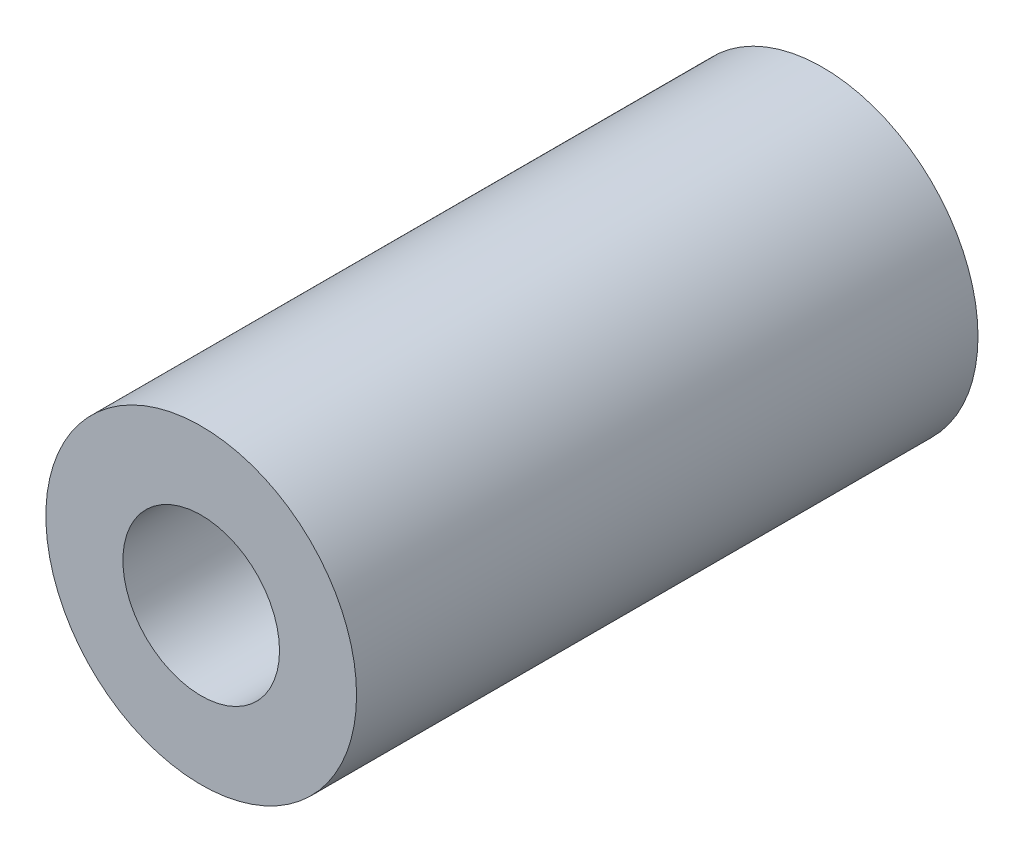
ISO-10303-21;
HEADER;
FILE_DESCRIPTION(('STEP AP214'),'2;1');
FILE_NAME('part.step','',(''),(''),'','','');
FILE_SCHEMA(('AUTOMOTIVE_DESIGN { 1 0 10303 214 1 1 1 1 }'));
ENDSEC;
DATA;
#1=APPLICATION_CONTEXT('core data for automotive mechanical design processes');
#2=APPLICATION_PROTOCOL_DEFINITION('international standard','automotive_design',2000,#1);
#3=PRODUCT_CONTEXT('',#1,'mechanical');
#4=PRODUCT('Part','Part','',(#3));
#5=PRODUCT_RELATED_PRODUCT_CATEGORY('part','',(#4));
#6=PRODUCT_DEFINITION_FORMATION('','',#4);
#7=PRODUCT_DEFINITION_CONTEXT('part definition',#1,'design');
#8=PRODUCT_DEFINITION('design','',#6,#7);
#9=PRODUCT_DEFINITION_SHAPE('','',#8);
#10=(LENGTH_UNIT() NAMED_UNIT(*) SI_UNIT(.MILLI.,.METRE.));
#11=(NAMED_UNIT(*) PLANE_ANGLE_UNIT() SI_UNIT($,.RADIAN.));
#12=(NAMED_UNIT(*) SI_UNIT($,.STERADIAN.) SOLID_ANGLE_UNIT());
#13=UNCERTAINTY_MEASURE_WITH_UNIT(LENGTH_MEASURE(1.E-05),#10,'distance_accuracy_value','');
#14=(GEOMETRIC_REPRESENTATION_CONTEXT(3) GLOBAL_UNCERTAINTY_ASSIGNED_CONTEXT((#13)) GLOBAL_UNIT_ASSIGNED_CONTEXT((#10,
#11,#12)) REPRESENTATION_CONTEXT('',''));
#15=CARTESIAN_POINT('',(0.,0.,0.));
#16=DIRECTION('',(0.,0.,1.));
#17=DIRECTION('',(1.,0.,0.));
#18=AXIS2_PLACEMENT_3D('',#15,#16,#17);
#19=CARTESIAN_POINT('',(0.,0.,12.7));
#20=DIRECTION('',(0.,0.,1.));
#21=DIRECTION('',(1.,0.,0.));
#22=AXIS2_PLACEMENT_3D('',#19,#20,#21);
#23=PLANE('',#22);
#24=CARTESIAN_POINT('',(0.,0.,12.7));
#25=DIRECTION('',(0.,0.,1.));
#26=DIRECTION('',(1.,0.,0.));
#27=AXIS2_PLACEMENT_3D('',#24,#25,#26);
#28=CIRCLE('',#27,6.35);
#29=CARTESIAN_POINT('',(6.35,0.,12.7));
#30=VERTEX_POINT('',#29);
#31=EDGE_CURVE('E10',#30,#30,#28,.T.);
#32=ORIENTED_EDGE('',*,*,#31,.T.);
#33=EDGE_LOOP('',(#32));
#34=FACE_BOUND('',#33,.T.);
#35=CARTESIAN_POINT('',(0.,0.,12.7));
#36=DIRECTION('',(0.,0.,1.));
#37=DIRECTION('',(1.,0.,0.));
#38=AXIS2_PLACEMENT_3D('',#35,#36,#37);
#39=CIRCLE('',#38,3.2004);
#40=CARTESIAN_POINT('',(3.2004,0.,12.7));
#41=VERTEX_POINT('',#40);
#42=EDGE_CURVE('E41',#41,#41,#39,.T.);
#43=ORIENTED_EDGE('',*,*,#42,.F.);
#44=EDGE_LOOP('',(#43));
#45=FACE_BOUND('',#44,.T.);
#46=ADVANCED_FACE('F30',(#34,#45),#23,.T.);
#47=CARTESIAN_POINT('',(0.,0.,-12.7));
#48=DIRECTION('',(0.,0.,1.));
#49=DIRECTION('',(1.,0.,0.));
#50=AXIS2_PLACEMENT_3D('',#47,#48,#49);
#51=PLANE('',#50);
#52=CARTESIAN_POINT('',(0.,0.,-12.7));
#53=DIRECTION('',(0.,0.,1.));
#54=DIRECTION('',(1.,0.,0.));
#55=AXIS2_PLACEMENT_3D('',#52,#53,#54);
#56=CIRCLE('',#55,6.35);
#57=CARTESIAN_POINT('',(6.35,0.,-12.7));
#58=VERTEX_POINT('',#57);
#59=EDGE_CURVE('E34',#58,#58,#56,.T.);
#60=ORIENTED_EDGE('',*,*,#59,.F.);
#61=EDGE_LOOP('',(#60));
#62=FACE_BOUND('',#61,.T.);
#63=CARTESIAN_POINT('',(0.,0.,-12.7));
#64=DIRECTION('',(0.,0.,1.));
#65=DIRECTION('',(1.,0.,0.));
#66=AXIS2_PLACEMENT_3D('',#63,#64,#65);
#67=CIRCLE('',#66,3.2004);
#68=CARTESIAN_POINT('',(3.2004,0.,-12.7));
#69=VERTEX_POINT('',#68);
#70=EDGE_CURVE('E43',#69,#69,#67,.T.);
#71=ORIENTED_EDGE('',*,*,#70,.T.);
#72=EDGE_LOOP('',(#71));
#73=FACE_BOUND('',#72,.T.);
#74=ADVANCED_FACE('F53',(#62,#73),#51,.F.);
#75=CARTESIAN_POINT('',(0.,0.,12.7));
#76=DIRECTION('',(0.,0.,-1.));
#77=DIRECTION('',(-1.,0.,0.));
#78=AXIS2_PLACEMENT_3D('',#75,#76,#77);
#79=CYLINDRICAL_SURFACE('',#78,6.35);
#80=ORIENTED_EDGE('',*,*,#31,.F.);
#81=EDGE_LOOP('',(#80));
#82=FACE_BOUND('',#81,.T.);
#83=ORIENTED_EDGE('',*,*,#59,.T.);
#84=EDGE_LOOP('',(#83));
#85=FACE_BOUND('',#84,.T.);
#86=ADVANCED_FACE('F32',(#82,#85),#79,.T.);
#87=CARTESIAN_POINT('',(0.,0.,12.7));
#88=DIRECTION('',(0.,0.,-1.));
#89=DIRECTION('',(-1.,0.,0.));
#90=AXIS2_PLACEMENT_3D('',#87,#88,#89);
#91=CYLINDRICAL_SURFACE('',#90,3.2004);
#92=ORIENTED_EDGE('',*,*,#42,.T.);
#93=EDGE_LOOP('',(#92));
#94=FACE_BOUND('',#93,.T.);
#95=ORIENTED_EDGE('',*,*,#70,.F.);
#96=EDGE_LOOP('',(#95));
#97=FACE_BOUND('',#96,.T.);
#98=ADVANCED_FACE('F49',(#94,#97),#91,.F.);
#99=CLOSED_SHELL('',(#46,#74,#86,#98));
#100=MANIFOLD_SOLID_BREP('B2',#99);
#101=ADVANCED_BREP_SHAPE_REPRESENTATION('',(#18,#100),#14);
#102=SHAPE_DEFINITION_REPRESENTATION(#9,#101);
ENDSEC;
END-ISO-10303-21;
